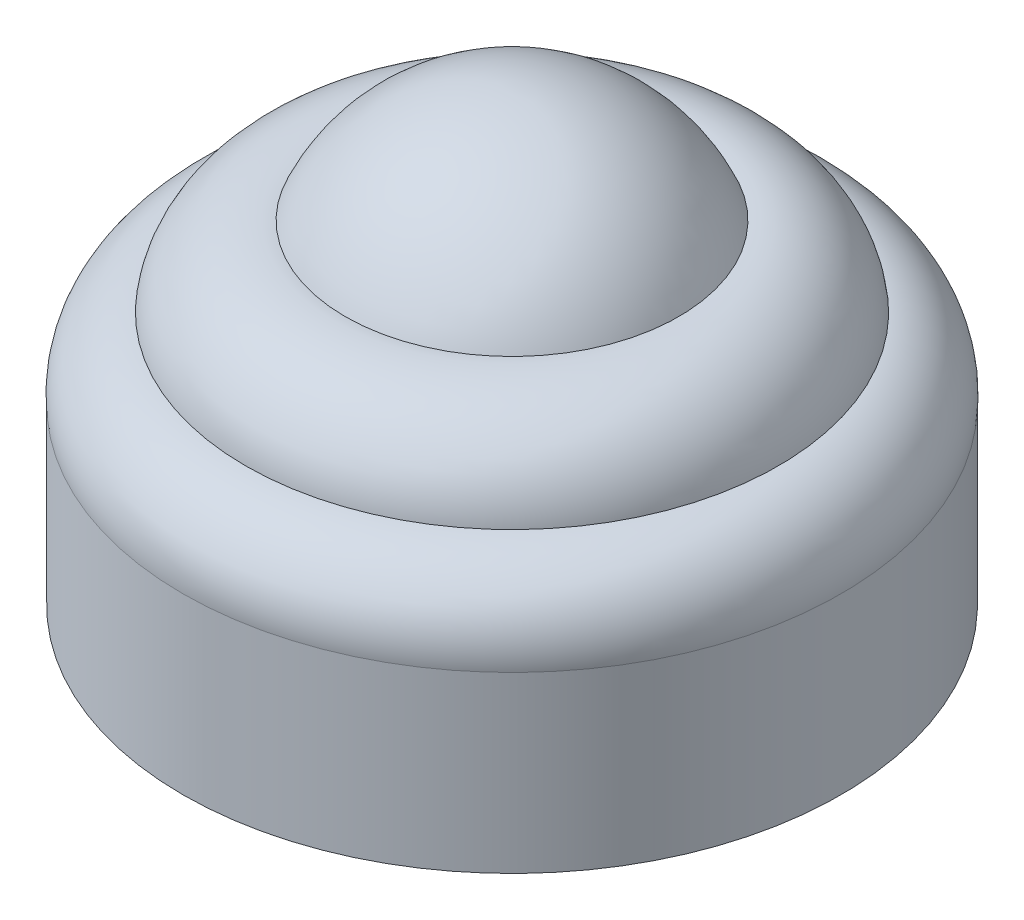
ISO-10303-21;
HEADER;
FILE_DESCRIPTION(('STEP AP214'),'2;1');
FILE_NAME('part.step','',(''),(''),'','','');
FILE_SCHEMA(('AUTOMOTIVE_DESIGN { 1 0 10303 214 1 1 1 1 }'));
ENDSEC;
DATA;
#1=APPLICATION_CONTEXT('core data for automotive mechanical design processes');
#2=APPLICATION_PROTOCOL_DEFINITION('international standard','automotive_design',2000,#1);
#3=PRODUCT_CONTEXT('',#1,'mechanical');
#4=PRODUCT('Part','Part','',(#3));
#5=PRODUCT_RELATED_PRODUCT_CATEGORY('part','',(#4));
#6=PRODUCT_DEFINITION_FORMATION('','',#4);
#7=PRODUCT_DEFINITION_CONTEXT('part definition',#1,'design');
#8=PRODUCT_DEFINITION('design','',#6,#7);
#9=PRODUCT_DEFINITION_SHAPE('','',#8);
#10=(LENGTH_UNIT() NAMED_UNIT(*) SI_UNIT(.MILLI.,.METRE.));
#11=(NAMED_UNIT(*) PLANE_ANGLE_UNIT() SI_UNIT($,.RADIAN.));
#12=(NAMED_UNIT(*) SI_UNIT($,.STERADIAN.) SOLID_ANGLE_UNIT());
#13=UNCERTAINTY_MEASURE_WITH_UNIT(LENGTH_MEASURE(1.E-05),#10,'distance_accuracy_value','');
#14=(GEOMETRIC_REPRESENTATION_CONTEXT(3) GLOBAL_UNCERTAINTY_ASSIGNED_CONTEXT((#13)) GLOBAL_UNIT_ASSIGNED_CONTEXT((#10,
#11,#12)) REPRESENTATION_CONTEXT('',''));
#15=CARTESIAN_POINT('',(0.,0.,0.));
#16=DIRECTION('',(0.,0.,1.));
#17=DIRECTION('',(1.,0.,0.));
#18=AXIS2_PLACEMENT_3D('',#15,#16,#17);
#19=CARTESIAN_POINT('',(0.,27.6548509677113,-31.6904360170892));
#20=DIRECTION('',(0.,1.,0.));
#21=DIRECTION('',(0.,0.,1.));
#22=AXIS2_PLACEMENT_3D('',#19,#20,#21);
#23=CYLINDRICAL_SURFACE('',#22,14.4931258454489);
#24=CARTESIAN_POINT('',(0.,12.9898597993779,-31.6904360170892));
#25=DIRECTION('',(0.,1.,0.));
#26=DIRECTION('',(0.,0.,1.));
#27=AXIS2_PLACEMENT_3D('',#24,#25,#26);
#28=CIRCLE('',#27,14.4931258454489);
#29=CARTESIAN_POINT('',(0.,12.9898597993779,-17.1973101716403));
#30=VERTEX_POINT('',#29);
#31=EDGE_CURVE('E10',#30,#30,#28,.T.);
#32=ORIENTED_EDGE('',*,*,#31,.T.);
#33=EDGE_LOOP('',(#32));
#34=FACE_BOUND('',#33,.T.);
#35=CARTESIAN_POINT('',(0.,20.6551027663409,-31.6904360170892));
#36=DIRECTION('',(0.,1.,0.));
#37=DIRECTION('',(0.,0.,1.));
#38=AXIS2_PLACEMENT_3D('',#35,#36,#37);
#39=CIRCLE('',#38,14.4931258454489);
#40=CARTESIAN_POINT('',(0.,20.6551027663409,-17.1973101716403));
#41=VERTEX_POINT('',#40);
#42=EDGE_CURVE('E45',#41,#41,#39,.T.);
#43=ORIENTED_EDGE('',*,*,#42,.F.);
#44=EDGE_LOOP('',(#43));
#45=FACE_BOUND('',#44,.T.);
#46=ADVANCED_FACE('F31',(#34,#45),#23,.T.);
#47=CARTESIAN_POINT('',(0.,12.9898597993779,-17.1973101716403));
#48=DIRECTION('',(0.,-1.,0.));
#49=DIRECTION('',(0.,0.,-1.));
#50=AXIS2_PLACEMENT_3D('',#47,#48,#49);
#51=PLANE('',#50);
#52=ORIENTED_EDGE('',*,*,#31,.F.);
#53=EDGE_LOOP('',(#52));
#54=FACE_BOUND('',#53,.T.);
#55=ADVANCED_FACE('F55',(#54),#51,.T.);
#56=CARTESIAN_POINT('',(0.,24.4898597993779,-31.6904360170892));
#57=DIRECTION('',(0.,1.,0.));
#58=DIRECTION('',(0.,0.,-1.));
#59=AXIS2_PLACEMENT_3D('',#56,#57,#58);
#60=SPHERICAL_SURFACE('',#59,7.99999999999999);
#61=CARTESIAN_POINT('',(0.,27.6548509677113,-31.6904360170892));
#62=DIRECTION('',(0.,1.,0.));
#63=DIRECTION('',(0.,0.,1.));
#64=AXIS2_PLACEMENT_3D('',#61,#62,#63);
#65=CIRCLE('',#64,7.34730092648805);
#66=CARTESIAN_POINT('',(0.,27.6548509677113,-24.3431350906011));
#67=VERTEX_POINT('',#66);
#68=EDGE_CURVE('E37',#67,#67,#65,.T.);
#69=ORIENTED_EDGE('',*,*,#68,.T.);
#70=EDGE_LOOP('',(#69));
#71=FACE_BOUND('',#70,.T.);
#72=ADVANCED_FACE('F59',(#71),#60,.T.);
#73=CARTESIAN_POINT('',(0.,23.7119028683332,-31.6904360170892));
#74=DIRECTION('',(0.,1.,0.));
#75=DIRECTION('',(0.,0.,1.));
#76=AXIS2_PLACEMENT_3D('',#73,#74,#75);
#77=TOROIDAL_SURFACE('',#76,7.78689694285301,3.9673775182093);
#78=CARTESIAN_POINT('',(0.,24.1514988846982,-31.6904360170892));
#79=DIRECTION('',(0.,1.,0.));
#80=DIRECTION('',(0.,0.,1.));
#81=AXIS2_PLACEMENT_3D('',#78,#79,#80);
#82=CIRCLE('',#81,11.729845042231);
#83=CARTESIAN_POINT('',(0.,24.1514988846982,-19.9605909748581));
#84=VERTEX_POINT('',#83);
#85=EDGE_CURVE('E41',#84,#84,#82,.T.);
#86=ORIENTED_EDGE('',*,*,#85,.T.);
#87=EDGE_LOOP('',(#86));
#88=FACE_BOUND('',#87,.T.);
#89=ORIENTED_EDGE('',*,*,#68,.F.);
#90=EDGE_LOOP('',(#89));
#91=FACE_BOUND('',#90,.T.);
#92=ADVANCED_FACE('F64',(#88,#91),#77,.T.);
#93=CARTESIAN_POINT('',(0.,21.0216604239106,-31.6904360170892));
#94=DIRECTION('',(0.,1.,0.));
#95=DIRECTION('',(0.,0.,1.));
#96=AXIS2_PLACEMENT_3D('',#93,#94,#95);
#97=TOROIDAL_SURFACE('',#96,11.3632873846613,3.1512304433266);
#98=ORIENTED_EDGE('',*,*,#42,.T.);
#99=EDGE_LOOP('',(#98));
#100=FACE_BOUND('',#99,.T.);
#101=ORIENTED_EDGE('',*,*,#85,.F.);
#102=EDGE_LOOP('',(#101));
#103=FACE_BOUND('',#102,.T.);
#104=ADVANCED_FACE('F51',(#100,#103),#97,.T.);
#105=CLOSED_SHELL('',(#46,#55,#72,#92,#104));
#106=MANIFOLD_SOLID_BREP('B2',#105);
#107=ADVANCED_BREP_SHAPE_REPRESENTATION('',(#18,#106),#14);
#108=SHAPE_DEFINITION_REPRESENTATION(#9,#107);
ENDSEC;
END-ISO-10303-21;
